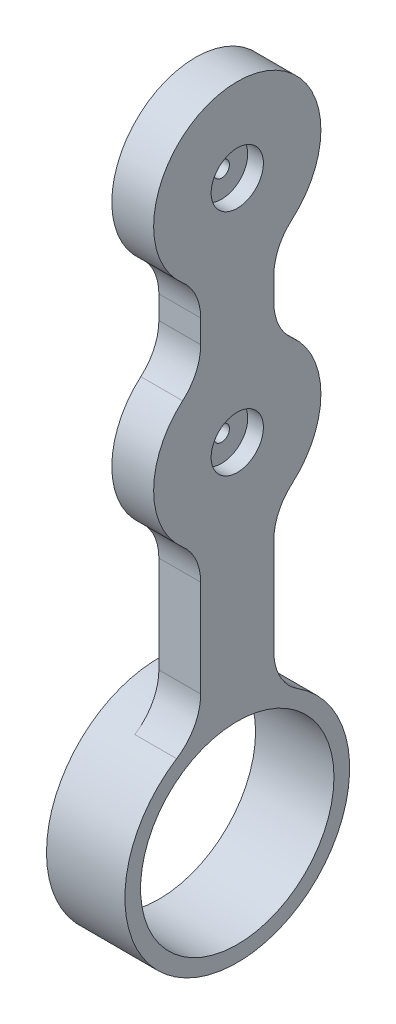
ISO-10303-21;
HEADER;
FILE_DESCRIPTION(('STEP AP214'),'2;1');
FILE_NAME('part.step','',(''),(''),'','','');
FILE_SCHEMA(('AUTOMOTIVE_DESIGN { 1 0 10303 214 1 1 1 1 }'));
ENDSEC;
DATA;
#1=APPLICATION_CONTEXT('core data for automotive mechanical design processes');
#2=APPLICATION_PROTOCOL_DEFINITION('international standard','automotive_design',2000,#1);
#3=PRODUCT_CONTEXT('',#1,'mechanical');
#4=PRODUCT('Part','Part','',(#3));
#5=PRODUCT_RELATED_PRODUCT_CATEGORY('part','',(#4));
#6=PRODUCT_DEFINITION_FORMATION('','',#4);
#7=PRODUCT_DEFINITION_CONTEXT('part definition',#1,'design');
#8=PRODUCT_DEFINITION('design','',#6,#7);
#9=PRODUCT_DEFINITION_SHAPE('','',#8);
#10=(LENGTH_UNIT() NAMED_UNIT(*) SI_UNIT(.MILLI.,.METRE.));
#11=(NAMED_UNIT(*) PLANE_ANGLE_UNIT() SI_UNIT($,.RADIAN.));
#12=(NAMED_UNIT(*) SI_UNIT($,.STERADIAN.) SOLID_ANGLE_UNIT());
#13=UNCERTAINTY_MEASURE_WITH_UNIT(LENGTH_MEASURE(1.E-05),#10,'distance_accuracy_value','');
#14=(GEOMETRIC_REPRESENTATION_CONTEXT(3) GLOBAL_UNCERTAINTY_ASSIGNED_CONTEXT((#13)) GLOBAL_UNIT_ASSIGNED_CONTEXT((#10,
#11,#12)) REPRESENTATION_CONTEXT('',''));
#15=CARTESIAN_POINT('',(0.,0.,0.));
#16=DIRECTION('',(0.,0.,1.));
#17=DIRECTION('',(1.,0.,0.));
#18=AXIS2_PLACEMENT_3D('',#15,#16,#17);
#19=CARTESIAN_POINT('',(-4.,-43.7749891398763,0.));
#20=DIRECTION('',(1.,0.,0.));
#21=DIRECTION('',(0.,0.,-1.));
#22=AXIS2_PLACEMENT_3D('',#19,#20,#21);
#23=PLANE('',#22);
#24=CARTESIAN_POINT('',(-4.,-43.7749891398763,0.));
#25=DIRECTION('',(1.,0.,0.));
#26=DIRECTION('',(0.,0.,-1.));
#27=AXIS2_PLACEMENT_3D('',#24,#25,#26);
#28=CIRCLE('',#27,1.5);
#29=CARTESIAN_POINT('',(-4.,-43.7749891398763,-1.5));
#30=VERTEX_POINT('',#29);
#31=EDGE_CURVE('E347',#30,#30,#28,.F.);
#32=ORIENTED_EDGE('',*,*,#31,.F.);
#33=EDGE_LOOP('',(#32));
#34=FACE_BOUND('',#33,.T.);
#35=CARTESIAN_POINT('',(-4.,0.,0.));
#36=DIRECTION('',(1.,0.,0.));
#37=DIRECTION('',(0.,0.,-1.));
#38=AXIS2_PLACEMENT_3D('',#35,#36,#37);
#39=CIRCLE('',#38,1.5);
#40=CARTESIAN_POINT('',(-4.,0.,-1.5));
#41=VERTEX_POINT('',#40);
#42=EDGE_CURVE('E339',#41,#41,#39,.F.);
#43=ORIENTED_EDGE('',*,*,#42,.F.);
#44=EDGE_LOOP('',(#43));
#45=FACE_BOUND('',#44,.T.);
#46=CARTESIAN_POINT('',(-4.,-108.491035060071,0.));
#47=DIRECTION('',(-1.,0.,0.));
#48=DIRECTION('',(0.,0.,1.));
#49=AXIS2_PLACEMENT_3D('',#46,#47,#48);
#50=CIRCLE('',#49,21.5);
#51=CARTESIAN_POINT('',(-4.,-90.3908599468778,11.6031746031746));
#52=VERTEX_POINT('',#51);
#53=CARTESIAN_POINT('',(-4.,-90.3908599468778,-11.6031746031746));
#54=VERTEX_POINT('',#53);
#55=EDGE_CURVE('E156',#52,#54,#50,.T.);
#56=ORIENTED_EDGE('',*,*,#55,.F.);
#57=CARTESIAN_POINT('',(-4.,-81.9721738477184,17.));
#58=DIRECTION('',(1.,0.,0.));
#59=DIRECTION('',(0.,0.,-1.));
#60=AXIS2_PLACEMENT_3D('',#57,#58,#59);
#61=CIRCLE('',#60,10.);
#62=CARTESIAN_POINT('',(-4.,-81.9721738477184,6.99999999999999));
#63=VERTEX_POINT('',#62);
#64=EDGE_CURVE('E160',#52,#63,#61,.T.);
#65=ORIENTED_EDGE('',*,*,#64,.T.);
#66=DIRECTION('',(0.,-1.,0.));
#67=VECTOR('',#66,1.);
#68=CARTESIAN_POINT('',(-4.,-58.1624837098145,7.));
#69=LINE('',#68,#67);
#70=CARTESIAN_POINT('',(-4.,-63.4473047127823,6.99999999999999));
#71=VERTEX_POINT('',#70);
#72=EDGE_CURVE('E241',#71,#63,#69,.T.);
#73=ORIENTED_EDGE('',*,*,#72,.F.);
#74=CARTESIAN_POINT('',(-4.,-63.4473047127823,17.));
#75=DIRECTION('',(1.,0.,0.));
#76=DIRECTION('',(0.,0.,-1.));
#77=AXIS2_PLACEMENT_3D('',#74,#75,#76);
#78=CIRCLE('',#77,10.);
#79=CARTESIAN_POINT('',(-4.,-55.8810294924339,10.4615384615385));
#80=VERTEX_POINT('',#79);
#81=EDGE_CURVE('E190',#71,#80,#78,.T.);
#82=ORIENTED_EDGE('',*,*,#81,.T.);
#83=CARTESIAN_POINT('',(-4.,-43.7749891398763,0.));
#84=DIRECTION('',(1.,0.,0.));
#85=DIRECTION('',(0.,0.,-1.));
#86=AXIS2_PLACEMENT_3D('',#83,#84,#85);
#87=CIRCLE('',#86,16.);
#88=CARTESIAN_POINT('',(-4.,-31.6689487873188,10.4615384615385));
#89=VERTEX_POINT('',#88);
#90=EDGE_CURVE('E239',#89,#80,#87,.T.);
#91=ORIENTED_EDGE('',*,*,#90,.F.);
#92=CARTESIAN_POINT('',(-4.,-24.1026735669703,17.));
#93=DIRECTION('',(1.,0.,0.));
#94=DIRECTION('',(0.,0.,-1.));
#95=AXIS2_PLACEMENT_3D('',#92,#93,#94);
#96=CIRCLE('',#95,10.);
#97=CARTESIAN_POINT('',(-4.,-24.1026735669703,7.));
#98=VERTEX_POINT('',#97);
#99=EDGE_CURVE('E205',#89,#98,#96,.T.);
#100=ORIENTED_EDGE('',*,*,#99,.T.);
#101=DIRECTION('',(0.,-1.,0.));
#102=VECTOR('',#101,1.);
#103=CARTESIAN_POINT('',(-4.,-14.3874945699382,7.));
#104=LINE('',#103,#102);
#105=CARTESIAN_POINT('',(-4.,-19.672315572906,7.));
#106=VERTEX_POINT('',#105);
#107=EDGE_CURVE('E258',#106,#98,#104,.T.);
#108=ORIENTED_EDGE('',*,*,#107,.F.);
#109=CARTESIAN_POINT('',(-4.,-19.672315572906,17.));
#110=DIRECTION('',(1.,0.,0.));
#111=DIRECTION('',(0.,0.,-1.));
#112=AXIS2_PLACEMENT_3D('',#109,#110,#111);
#113=CIRCLE('',#112,10.);
#114=CARTESIAN_POINT('',(-4.,-12.1060403525575,10.4615384615385));
#115=VERTEX_POINT('',#114);
#116=EDGE_CURVE('E59',#106,#115,#113,.T.);
#117=ORIENTED_EDGE('',*,*,#116,.T.);
#118=CARTESIAN_POINT('',(-4.,0.,0.));
#119=DIRECTION('',(1.,0.,0.));
#120=DIRECTION('',(0.,0.,-1.));
#121=AXIS2_PLACEMENT_3D('',#118,#119,#120);
#122=CIRCLE('',#121,16.);
#123=CARTESIAN_POINT('',(-4.,-12.1060403525575,-10.4615384615385));
#124=VERTEX_POINT('',#123);
#125=EDGE_CURVE('E283',#124,#115,#122,.T.);
#126=ORIENTED_EDGE('',*,*,#125,.F.);
#127=CARTESIAN_POINT('',(-4.,-19.672315572906,-17.));
#128=DIRECTION('',(1.,0.,0.));
#129=DIRECTION('',(0.,0.,-1.));
#130=AXIS2_PLACEMENT_3D('',#127,#128,#129);
#131=CIRCLE('',#130,10.);
#132=CARTESIAN_POINT('',(-4.,-19.672315572906,-7.));
#133=VERTEX_POINT('',#132);
#134=EDGE_CURVE('E12',#124,#133,#131,.T.);
#135=ORIENTED_EDGE('',*,*,#134,.T.);
#136=DIRECTION('',(0.,-1.,0.));
#137=VECTOR('',#136,1.);
#138=CARTESIAN_POINT('',(-4.,-14.3874945699382,-7.));
#139=LINE('',#138,#137);
#140=CARTESIAN_POINT('',(-4.,-24.1026735669703,-7.));
#141=VERTEX_POINT('',#140);
#142=EDGE_CURVE('E294',#133,#141,#139,.T.);
#143=ORIENTED_EDGE('',*,*,#142,.T.);
#144=CARTESIAN_POINT('',(-4.,-24.1026735669703,-17.));
#145=DIRECTION('',(1.,0.,0.));
#146=DIRECTION('',(0.,0.,-1.));
#147=AXIS2_PLACEMENT_3D('',#144,#145,#146);
#148=CIRCLE('',#147,10.);
#149=CARTESIAN_POINT('',(-4.,-31.6689487873188,-10.4615384615385));
#150=VERTEX_POINT('',#149);
#151=EDGE_CURVE('E201',#141,#150,#148,.T.);
#152=ORIENTED_EDGE('',*,*,#151,.T.);
#153=CARTESIAN_POINT('',(-4.,-43.7749891398763,0.));
#154=DIRECTION('',(1.,0.,0.));
#155=DIRECTION('',(0.,0.,-1.));
#156=AXIS2_PLACEMENT_3D('',#153,#154,#155);
#157=CIRCLE('',#156,16.);
#158=CARTESIAN_POINT('',(-4.,-55.8810294924339,-10.4615384615385));
#159=VERTEX_POINT('',#158);
#160=EDGE_CURVE('E291',#159,#150,#157,.T.);
#161=ORIENTED_EDGE('',*,*,#160,.F.);
#162=CARTESIAN_POINT('',(-4.,-63.4473047127823,-17.));
#163=DIRECTION('',(1.,0.,0.));
#164=DIRECTION('',(0.,0.,-1.));
#165=AXIS2_PLACEMENT_3D('',#162,#163,#164);
#166=CIRCLE('',#165,10.);
#167=CARTESIAN_POINT('',(-4.,-63.4473047127823,-6.99999999999999));
#168=VERTEX_POINT('',#167);
#169=EDGE_CURVE('E197',#159,#168,#166,.T.);
#170=ORIENTED_EDGE('',*,*,#169,.T.);
#171=DIRECTION('',(0.,-1.,0.));
#172=VECTOR('',#171,1.);
#173=CARTESIAN_POINT('',(-4.,-58.1624837098145,-7.));
#174=LINE('',#173,#172);
#175=CARTESIAN_POINT('',(-4.,-81.9721738477184,-6.99999999999999));
#176=VERTEX_POINT('',#175);
#177=EDGE_CURVE('E289',#168,#176,#174,.T.);
#178=ORIENTED_EDGE('',*,*,#177,.T.);
#179=CARTESIAN_POINT('',(-4.,-81.9721738477184,-17.));
#180=DIRECTION('',(1.,0.,0.));
#181=DIRECTION('',(0.,0.,-1.));
#182=AXIS2_PLACEMENT_3D('',#179,#180,#181);
#183=CIRCLE('',#182,10.);
#184=EDGE_CURVE('E164',#176,#54,#183,.T.);
#185=ORIENTED_EDGE('',*,*,#184,.T.);
#186=EDGE_LOOP('',(#56,#65,#73,#82,#91,#100,#108,#117,#126,#135,#143,#152,#161,#170,#178,#185));
#187=FACE_BOUND('',#186,.T.);
#188=ADVANCED_FACE('F44',(#34,#45,#187),#23,.F.);
#189=CARTESIAN_POINT('',(-4.,-43.7749891398763,0.));
#190=DIRECTION('',(1.,0.,0.));
#191=DIRECTION('',(0.,0.,-1.));
#192=AXIS2_PLACEMENT_3D('',#189,#190,#191);
#193=CYLINDRICAL_SURFACE('',#192,16.);
#194=ORIENTED_EDGE('',*,*,#90,.T.);
#195=DIRECTION('',(1.,0.,0.));
#196=VECTOR('',#195,1.);
#197=CARTESIAN_POINT('',(-4.,-55.8810294924339,10.4615384615385));
#198=LINE('',#197,#196);
#199=CARTESIAN_POINT('',(4.,-55.8810294924339,10.4615384615385));
#200=VERTEX_POINT('',#199);
#201=EDGE_CURVE('E249',#80,#200,#198,.T.);
#202=ORIENTED_EDGE('',*,*,#201,.T.);
#203=CARTESIAN_POINT('',(4.,-43.7749891398763,0.));
#204=DIRECTION('',(1.,0.,0.));
#205=DIRECTION('',(0.,0.,-1.));
#206=AXIS2_PLACEMENT_3D('',#203,#204,#205);
#207=CIRCLE('',#206,16.);
#208=CARTESIAN_POINT('',(4.,-31.6689487873188,10.4615384615385));
#209=VERTEX_POINT('',#208);
#210=EDGE_CURVE('E329',#209,#200,#207,.T.);
#211=ORIENTED_EDGE('',*,*,#210,.F.);
#212=DIRECTION('',(1.,0.,0.));
#213=VECTOR('',#212,1.);
#214=CARTESIAN_POINT('',(-4.,-31.6689487873188,10.4615384615385));
#215=LINE('',#214,#213);
#216=EDGE_CURVE('E252',#209,#89,#215,.F.);
#217=ORIENTED_EDGE('',*,*,#216,.T.);
#218=EDGE_LOOP('',(#194,#202,#211,#217));
#219=FACE_BOUND('',#218,.T.);
#220=ADVANCED_FACE('F247',(#219),#193,.T.);
#221=CARTESIAN_POINT('',(-4.,-14.3874945699382,7.));
#222=DIRECTION('',(0.,0.,1.));
#223=DIRECTION('',(0.,-1.,0.));
#224=AXIS2_PLACEMENT_3D('',#221,#222,#223);
#225=PLANE('',#224);
#226=ORIENTED_EDGE('',*,*,#107,.T.);
#227=DIRECTION('',(-1.,0.,0.));
#228=VECTOR('',#227,1.);
#229=CARTESIAN_POINT('',(4.,-24.1026735669703,7.));
#230=LINE('',#229,#228);
#231=CARTESIAN_POINT('',(4.,-24.1026735669703,7.));
#232=VERTEX_POINT('',#231);
#233=EDGE_CURVE('E227',#98,#232,#230,.F.);
#234=ORIENTED_EDGE('',*,*,#233,.T.);
#235=DIRECTION('',(0.,-1.,0.));
#236=VECTOR('',#235,1.);
#237=CARTESIAN_POINT('',(4.,-14.3874945699382,7.));
#238=LINE('',#237,#236);
#239=CARTESIAN_POINT('',(4.,-19.672315572906,7.));
#240=VERTEX_POINT('',#239);
#241=EDGE_CURVE('E224',#240,#232,#238,.T.);
#242=ORIENTED_EDGE('',*,*,#241,.F.);
#243=DIRECTION('',(-1.,0.,0.));
#244=VECTOR('',#243,1.);
#245=CARTESIAN_POINT('',(-4.,-19.672315572906,7.));
#246=LINE('',#245,#244);
#247=EDGE_CURVE('E232',#240,#106,#246,.T.);
#248=ORIENTED_EDGE('',*,*,#247,.T.);
#249=EDGE_LOOP('',(#226,#234,#242,#248));
#250=FACE_BOUND('',#249,.T.);
#251=ADVANCED_FACE('F280',(#250),#225,.T.);
#252=CARTESIAN_POINT('',(-4.,0.,0.));
#253=DIRECTION('',(1.,0.,0.));
#254=DIRECTION('',(0.,0.,-1.));
#255=AXIS2_PLACEMENT_3D('',#252,#253,#254);
#256=CYLINDRICAL_SURFACE('',#255,16.);
#257=ORIENTED_EDGE('',*,*,#125,.T.);
#258=DIRECTION('',(1.,0.,0.));
#259=VECTOR('',#258,1.);
#260=CARTESIAN_POINT('',(-4.,-12.1060403525575,10.4615384615385));
#261=LINE('',#260,#259);
#262=CARTESIAN_POINT('',(4.,-12.1060403525575,10.4615384615385));
#263=VERTEX_POINT('',#262);
#264=EDGE_CURVE('E223',#115,#263,#261,.T.);
#265=ORIENTED_EDGE('',*,*,#264,.T.);
#266=CARTESIAN_POINT('',(4.,0.,0.));
#267=DIRECTION('',(1.,0.,0.));
#268=DIRECTION('',(0.,0.,-1.));
#269=AXIS2_PLACEMENT_3D('',#266,#267,#268);
#270=CIRCLE('',#269,16.);
#271=CARTESIAN_POINT('',(4.,-12.1060403525575,-10.4615384615385));
#272=VERTEX_POINT('',#271);
#273=EDGE_CURVE('E214',#272,#263,#270,.T.);
#274=ORIENTED_EDGE('',*,*,#273,.F.);
#275=DIRECTION('',(1.,0.,0.));
#276=VECTOR('',#275,1.);
#277=CARTESIAN_POINT('',(-4.,-12.1060403525575,-10.4615384615385));
#278=LINE('',#277,#276);
#279=EDGE_CURVE('E66',#272,#124,#278,.F.);
#280=ORIENTED_EDGE('',*,*,#279,.T.);
#281=EDGE_LOOP('',(#257,#265,#274,#280));
#282=FACE_BOUND('',#281,.T.);
#283=ADVANCED_FACE('F221',(#282),#256,.T.);
#284=CARTESIAN_POINT('',(-4.,-14.3874945699382,-7.));
#285=DIRECTION('',(0.,0.,1.));
#286=DIRECTION('',(0.,-1.,0.));
#287=AXIS2_PLACEMENT_3D('',#284,#285,#286);
#288=PLANE('',#287);
#289=DIRECTION('',(0.,-1.,0.));
#290=VECTOR('',#289,1.);
#291=CARTESIAN_POINT('',(4.,-14.3874945699382,-7.));
#292=LINE('',#291,#290);
#293=CARTESIAN_POINT('',(4.,-19.672315572906,-7.));
#294=VERTEX_POINT('',#293);
#295=CARTESIAN_POINT('',(4.,-24.1026735669703,-7.));
#296=VERTEX_POINT('',#295);
#297=EDGE_CURVE('E216',#294,#296,#292,.T.);
#298=ORIENTED_EDGE('',*,*,#297,.T.);
#299=DIRECTION('',(1.,0.,0.));
#300=VECTOR('',#299,1.);
#301=CARTESIAN_POINT('',(-4.,-24.1026735669703,-7.));
#302=LINE('',#301,#300);
#303=EDGE_CURVE('E275',#296,#141,#302,.F.);
#304=ORIENTED_EDGE('',*,*,#303,.T.);
#305=ORIENTED_EDGE('',*,*,#142,.F.);
#306=DIRECTION('',(1.,0.,0.));
#307=VECTOR('',#306,1.);
#308=CARTESIAN_POINT('',(-4.,-19.672315572906,-7.));
#309=LINE('',#308,#307);
#310=EDGE_CURVE('E273',#133,#294,#309,.T.);
#311=ORIENTED_EDGE('',*,*,#310,.T.);
#312=EDGE_LOOP('',(#298,#304,#305,#311));
#313=FACE_BOUND('',#312,.T.);
#314=ADVANCED_FACE('F300',(#313),#288,.F.);
#315=CARTESIAN_POINT('',(-4.,-43.7749891398763,0.));
#316=DIRECTION('',(1.,0.,0.));
#317=DIRECTION('',(0.,0.,-1.));
#318=AXIS2_PLACEMENT_3D('',#315,#316,#317);
#319=CYLINDRICAL_SURFACE('',#318,16.);
#320=CARTESIAN_POINT('',(4.,-43.7749891398763,0.));
#321=DIRECTION('',(1.,0.,0.));
#322=DIRECTION('',(0.,0.,-1.));
#323=AXIS2_PLACEMENT_3D('',#320,#321,#322);
#324=CIRCLE('',#323,16.);
#325=CARTESIAN_POINT('',(4.,-55.8810294924339,-10.4615384615385));
#326=VERTEX_POINT('',#325);
#327=CARTESIAN_POINT('',(4.,-31.6689487873188,-10.4615384615385));
#328=VERTEX_POINT('',#327);
#329=EDGE_CURVE('E312',#326,#328,#324,.T.);
#330=ORIENTED_EDGE('',*,*,#329,.F.);
#331=DIRECTION('',(1.,0.,0.));
#332=VECTOR('',#331,1.);
#333=CARTESIAN_POINT('',(-4.,-55.8810294924339,-10.4615384615385));
#334=LINE('',#333,#332);
#335=EDGE_CURVE('E271',#326,#159,#334,.F.);
#336=ORIENTED_EDGE('',*,*,#335,.T.);
#337=ORIENTED_EDGE('',*,*,#160,.T.);
#338=DIRECTION('',(1.,0.,0.));
#339=VECTOR('',#338,1.);
#340=CARTESIAN_POINT('',(-4.,-31.6689487873188,-10.4615384615385));
#341=LINE('',#340,#339);
#342=EDGE_CURVE('E268',#150,#328,#341,.T.);
#343=ORIENTED_EDGE('',*,*,#342,.T.);
#344=EDGE_LOOP('',(#330,#336,#337,#343));
#345=FACE_BOUND('',#344,.T.);
#346=ADVANCED_FACE('F309',(#345),#319,.T.);
#347=CARTESIAN_POINT('',(-4.,-58.1624837098145,-7.));
#348=DIRECTION('',(0.,0.,1.));
#349=DIRECTION('',(0.,-1.,0.));
#350=AXIS2_PLACEMENT_3D('',#347,#348,#349);
#351=PLANE('',#350);
#352=DIRECTION('',(0.,-1.,0.));
#353=VECTOR('',#352,1.);
#354=CARTESIAN_POINT('',(4.,-58.1624837098145,-7.));
#355=LINE('',#354,#353);
#356=CARTESIAN_POINT('',(4.,-63.4473047127823,-6.99999999999999));
#357=VERTEX_POINT('',#356);
#358=CARTESIAN_POINT('',(4.,-81.9721738477184,-6.99999999999999));
#359=VERTEX_POINT('',#358);
#360=EDGE_CURVE('E322',#357,#359,#355,.T.);
#361=ORIENTED_EDGE('',*,*,#360,.T.);
#362=DIRECTION('',(1.,0.,0.));
#363=VECTOR('',#362,1.);
#364=CARTESIAN_POINT('',(-4.,-81.9721738477184,-6.99999999999999));
#365=LINE('',#364,#363);
#366=EDGE_CURVE('E266',#359,#176,#365,.F.);
#367=ORIENTED_EDGE('',*,*,#366,.T.);
#368=ORIENTED_EDGE('',*,*,#177,.F.);
#369=DIRECTION('',(1.,0.,0.));
#370=VECTOR('',#369,1.);
#371=CARTESIAN_POINT('',(-4.,-63.4473047127823,-6.99999999999999));
#372=LINE('',#371,#370);
#373=EDGE_CURVE('E179',#168,#357,#372,.T.);
#374=ORIENTED_EDGE('',*,*,#373,.T.);
#375=EDGE_LOOP('',(#361,#367,#368,#374));
#376=FACE_BOUND('',#375,.T.);
#377=ADVANCED_FACE('F319',(#376),#351,.F.);
#378=CARTESIAN_POINT('',(-4.,-108.491035060071,0.));
#379=DIRECTION('',(1.,0.,0.));
#380=DIRECTION('',(0.,0.,-1.));
#381=AXIS2_PLACEMENT_3D('',#378,#379,#380);
#382=CYLINDRICAL_SURFACE('',#381,21.5);
#383=CARTESIAN_POINT('',(4.,-108.491035060071,0.));
#384=DIRECTION('',(1.,0.,0.));
#385=DIRECTION('',(0.,0.,-1.));
#386=AXIS2_PLACEMENT_3D('',#383,#384,#385);
#387=CIRCLE('',#386,21.5);
#388=CARTESIAN_POINT('',(4.,-90.3908599468778,11.6031746031746));
#389=VERTEX_POINT('',#388);
#390=CARTESIAN_POINT('',(4.,-90.3908599468778,-11.6031746031746));
#391=VERTEX_POINT('',#390);
#392=EDGE_CURVE('E177',#389,#391,#387,.T.);
#393=ORIENTED_EDGE('',*,*,#392,.F.);
#394=DIRECTION('',(1.,0.,0.));
#395=VECTOR('',#394,1.);
#396=CARTESIAN_POINT('',(-4.,-90.3908599468778,11.6031746031746));
#397=LINE('',#396,#395);
#398=EDGE_CURVE('E173',#389,#52,#397,.F.);
#399=ORIENTED_EDGE('',*,*,#398,.T.);
#400=ORIENTED_EDGE('',*,*,#55,.T.);
#401=DIRECTION('',(1.,0.,0.));
#402=VECTOR('',#401,1.);
#403=CARTESIAN_POINT('',(-4.,-90.3908599468778,-11.6031746031746));
#404=LINE('',#403,#402);
#405=EDGE_CURVE('E180',#54,#391,#404,.T.);
#406=ORIENTED_EDGE('',*,*,#405,.T.);
#407=EDGE_LOOP('',(#393,#399,#400,#406));
#408=FACE_BOUND('',#407,.T.);
#409=CARTESIAN_POINT('',(-11.,-108.491035060071,0.));
#410=DIRECTION('',(-1.,0.,0.));
#411=DIRECTION('',(0.,0.,1.));
#412=AXIS2_PLACEMENT_3D('',#409,#410,#411);
#413=CIRCLE('',#412,21.5);
#414=CARTESIAN_POINT('',(-11.,-108.491035060071,21.5));
#415=VERTEX_POINT('',#414);
#416=EDGE_CURVE('E168',#415,#415,#413,.T.);
#417=ORIENTED_EDGE('',*,*,#416,.F.);
#418=EDGE_LOOP('',(#417));
#419=FACE_BOUND('',#418,.T.);
#420=ADVANCED_FACE('F174',(#408,#419),#382,.T.);
#421=CARTESIAN_POINT('',(-4.,-58.1624837098145,7.));
#422=DIRECTION('',(0.,0.,1.));
#423=DIRECTION('',(0.,-1.,0.));
#424=AXIS2_PLACEMENT_3D('',#421,#422,#423);
#425=PLANE('',#424);
#426=DIRECTION('',(0.,-1.,0.));
#427=VECTOR('',#426,1.);
#428=CARTESIAN_POINT('',(4.,-58.1624837098145,7.));
#429=LINE('',#428,#427);
#430=CARTESIAN_POINT('',(4.,-63.4473047127823,6.99999999999999));
#431=VERTEX_POINT('',#430);
#432=CARTESIAN_POINT('',(4.,-81.9721738477184,6.99999999999999));
#433=VERTEX_POINT('',#432);
#434=EDGE_CURVE('E326',#431,#433,#429,.T.);
#435=ORIENTED_EDGE('',*,*,#434,.F.);
#436=DIRECTION('',(-1.,0.,0.));
#437=VECTOR('',#436,1.);
#438=CARTESIAN_POINT('',(-4.,-63.4473047127823,7.));
#439=LINE('',#438,#437);
#440=EDGE_CURVE('E256',#431,#71,#439,.T.);
#441=ORIENTED_EDGE('',*,*,#440,.T.);
#442=ORIENTED_EDGE('',*,*,#72,.T.);
#443=DIRECTION('',(-1.,0.,0.));
#444=VECTOR('',#443,1.);
#445=CARTESIAN_POINT('',(4.,-81.9721738477184,6.99999999999999));
#446=LINE('',#445,#444);
#447=EDGE_CURVE('E185',#63,#433,#446,.F.);
#448=ORIENTED_EDGE('',*,*,#447,.T.);
#449=EDGE_LOOP('',(#435,#441,#442,#448));
#450=FACE_BOUND('',#449,.T.);
#451=ADVANCED_FACE('F406',(#450),#425,.T.);
#452=CARTESIAN_POINT('',(4.,-43.7749891398763,0.));
#453=DIRECTION('',(1.,0.,0.));
#454=DIRECTION('',(0.,0.,-1.));
#455=AXIS2_PLACEMENT_3D('',#452,#453,#454);
#456=PLANE('',#455);
#457=CARTESIAN_POINT('',(4.,-108.491035060071,0.));
#458=DIRECTION('',(1.,0.,0.));
#459=DIRECTION('',(0.,0.,-1.));
#460=AXIS2_PLACEMENT_3D('',#457,#458,#459);
#461=CIRCLE('',#460,18.5);
#462=CARTESIAN_POINT('',(4.,-108.491035060071,-18.5));
#463=VERTEX_POINT('',#462);
#464=EDGE_CURVE('E354',#463,#463,#461,.T.);
#465=ORIENTED_EDGE('',*,*,#464,.F.);
#466=EDGE_LOOP('',(#465));
#467=FACE_BOUND('',#466,.T.);
#468=CARTESIAN_POINT('',(4.,0.,0.));
#469=DIRECTION('',(1.,0.,0.));
#470=DIRECTION('',(0.,0.,-1.));
#471=AXIS2_PLACEMENT_3D('',#468,#469,#470);
#472=CIRCLE('',#471,5.);
#473=CARTESIAN_POINT('',(4.,0.,-5.));
#474=VERTEX_POINT('',#473);
#475=EDGE_CURVE('E342',#474,#474,#472,.T.);
#476=ORIENTED_EDGE('',*,*,#475,.F.);
#477=EDGE_LOOP('',(#476));
#478=FACE_BOUND('',#477,.T.);
#479=CARTESIAN_POINT('',(4.,-43.7749891398763,0.));
#480=DIRECTION('',(1.,0.,0.));
#481=DIRECTION('',(0.,0.,-1.));
#482=AXIS2_PLACEMENT_3D('',#479,#480,#481);
#483=CIRCLE('',#482,5.);
#484=CARTESIAN_POINT('',(4.,-43.7749891398763,-5.));
#485=VERTEX_POINT('',#484);
#486=EDGE_CURVE('E335',#485,#485,#483,.T.);
#487=ORIENTED_EDGE('',*,*,#486,.F.);
#488=EDGE_LOOP('',(#487));
#489=FACE_BOUND('',#488,.T.);
#490=ORIENTED_EDGE('',*,*,#241,.T.);
#491=CARTESIAN_POINT('',(4.,-24.1026735669703,17.));
#492=DIRECTION('',(1.,0.,0.));
#493=DIRECTION('',(0.,0.,-1.));
#494=AXIS2_PLACEMENT_3D('',#491,#492,#493);
#495=CIRCLE('',#494,10.);
#496=EDGE_CURVE('E203',#232,#209,#495,.F.);
#497=ORIENTED_EDGE('',*,*,#496,.T.);
#498=ORIENTED_EDGE('',*,*,#210,.T.);
#499=CARTESIAN_POINT('',(4.,-63.4473047127823,17.));
#500=DIRECTION('',(1.,0.,0.));
#501=DIRECTION('',(0.,0.,-1.));
#502=AXIS2_PLACEMENT_3D('',#499,#500,#501);
#503=CIRCLE('',#502,10.);
#504=EDGE_CURVE('E229',#200,#431,#503,.F.);
#505=ORIENTED_EDGE('',*,*,#504,.T.);
#506=ORIENTED_EDGE('',*,*,#434,.T.);
#507=CARTESIAN_POINT('',(4.,-81.9721738477184,17.));
#508=DIRECTION('',(1.,0.,0.));
#509=DIRECTION('',(0.,0.,-1.));
#510=AXIS2_PLACEMENT_3D('',#507,#508,#509);
#511=CIRCLE('',#510,10.);
#512=EDGE_CURVE('E187',#433,#389,#511,.F.);
#513=ORIENTED_EDGE('',*,*,#512,.T.);
#514=ORIENTED_EDGE('',*,*,#392,.T.);
#515=CARTESIAN_POINT('',(4.,-81.9721738477184,-17.));
#516=DIRECTION('',(1.,0.,0.));
#517=DIRECTION('',(0.,0.,-1.));
#518=AXIS2_PLACEMENT_3D('',#515,#516,#517);
#519=CIRCLE('',#518,10.);
#520=EDGE_CURVE('E186',#391,#359,#519,.F.);
#521=ORIENTED_EDGE('',*,*,#520,.T.);
#522=ORIENTED_EDGE('',*,*,#360,.F.);
#523=CARTESIAN_POINT('',(4.,-63.4473047127823,-17.));
#524=DIRECTION('',(1.,0.,0.));
#525=DIRECTION('',(0.,0.,-1.));
#526=AXIS2_PLACEMENT_3D('',#523,#524,#525);
#527=CIRCLE('',#526,10.);
#528=EDGE_CURVE('E195',#357,#326,#527,.F.);
#529=ORIENTED_EDGE('',*,*,#528,.T.);
#530=ORIENTED_EDGE('',*,*,#329,.T.);
#531=CARTESIAN_POINT('',(4.,-24.1026735669703,-17.));
#532=DIRECTION('',(1.,0.,0.));
#533=DIRECTION('',(0.,0.,-1.));
#534=AXIS2_PLACEMENT_3D('',#531,#532,#533);
#535=CIRCLE('',#534,10.);
#536=EDGE_CURVE('E199',#328,#296,#535,.F.);
#537=ORIENTED_EDGE('',*,*,#536,.T.);
#538=ORIENTED_EDGE('',*,*,#297,.F.);
#539=CARTESIAN_POINT('',(4.,-19.672315572906,-17.));
#540=DIRECTION('',(1.,0.,0.));
#541=DIRECTION('',(0.,0.,-1.));
#542=AXIS2_PLACEMENT_3D('',#539,#540,#541);
#543=CIRCLE('',#542,10.);
#544=EDGE_CURVE('E52',#294,#272,#543,.F.);
#545=ORIENTED_EDGE('',*,*,#544,.T.);
#546=ORIENTED_EDGE('',*,*,#273,.T.);
#547=CARTESIAN_POINT('',(4.,-19.672315572906,17.));
#548=DIRECTION('',(1.,0.,0.));
#549=DIRECTION('',(0.,0.,-1.));
#550=AXIS2_PLACEMENT_3D('',#547,#548,#549);
#551=CIRCLE('',#550,10.);
#552=EDGE_CURVE('E207',#263,#240,#551,.F.);
#553=ORIENTED_EDGE('',*,*,#552,.T.);
#554=EDGE_LOOP('',(#490,#497,#498,#505,#506,#513,#514,#521,#522,#529,#530,#537,#538,#545,#546,#553));
#555=FACE_BOUND('',#554,.T.);
#556=ADVANCED_FACE('F213',(#467,#478,#489,#555),#456,.T.);
#557=CARTESIAN_POINT('',(-4.,-63.4473047127823,17.));
#558=DIRECTION('',(1.,0.,0.));
#559=DIRECTION('',(0.,0.,-1.));
#560=AXIS2_PLACEMENT_3D('',#557,#558,#559);
#561=CYLINDRICAL_SURFACE('',#560,10.);
#562=ORIENTED_EDGE('',*,*,#81,.F.);
#563=ORIENTED_EDGE('',*,*,#440,.F.);
#564=ORIENTED_EDGE('',*,*,#504,.F.);
#565=ORIENTED_EDGE('',*,*,#201,.F.);
#566=EDGE_LOOP('',(#562,#563,#564,#565));
#567=FACE_BOUND('',#566,.T.);
#568=ADVANCED_FACE('F254',(#567),#561,.F.);
#569=CARTESIAN_POINT('',(-4.,-81.9721738477184,17.));
#570=DIRECTION('',(1.,0.,0.));
#571=DIRECTION('',(0.,0.,-1.));
#572=AXIS2_PLACEMENT_3D('',#569,#570,#571);
#573=CYLINDRICAL_SURFACE('',#572,10.);
#574=ORIENTED_EDGE('',*,*,#64,.F.);
#575=ORIENTED_EDGE('',*,*,#398,.F.);
#576=ORIENTED_EDGE('',*,*,#512,.F.);
#577=ORIENTED_EDGE('',*,*,#447,.F.);
#578=EDGE_LOOP('',(#574,#575,#576,#577));
#579=FACE_BOUND('',#578,.T.);
#580=ADVANCED_FACE('F183',(#579),#573,.F.);
#581=CARTESIAN_POINT('',(-4.,-81.9721738477184,-17.));
#582=DIRECTION('',(1.,0.,0.));
#583=DIRECTION('',(0.,0.,-1.));
#584=AXIS2_PLACEMENT_3D('',#581,#582,#583);
#585=CYLINDRICAL_SURFACE('',#584,10.);
#586=ORIENTED_EDGE('',*,*,#184,.F.);
#587=ORIENTED_EDGE('',*,*,#366,.F.);
#588=ORIENTED_EDGE('',*,*,#520,.F.);
#589=ORIENTED_EDGE('',*,*,#405,.F.);
#590=EDGE_LOOP('',(#586,#587,#588,#589));
#591=FACE_BOUND('',#590,.T.);
#592=ADVANCED_FACE('F324',(#591),#585,.F.);
#593=CARTESIAN_POINT('',(-4.,-63.4473047127823,-17.));
#594=DIRECTION('',(1.,0.,0.));
#595=DIRECTION('',(0.,0.,-1.));
#596=AXIS2_PLACEMENT_3D('',#593,#594,#595);
#597=CYLINDRICAL_SURFACE('',#596,10.);
#598=ORIENTED_EDGE('',*,*,#169,.F.);
#599=ORIENTED_EDGE('',*,*,#335,.F.);
#600=ORIENTED_EDGE('',*,*,#528,.F.);
#601=ORIENTED_EDGE('',*,*,#373,.F.);
#602=EDGE_LOOP('',(#598,#599,#600,#601));
#603=FACE_BOUND('',#602,.T.);
#604=ADVANCED_FACE('F314',(#603),#597,.F.);
#605=CARTESIAN_POINT('',(-4.,-24.1026735669703,-17.));
#606=DIRECTION('',(1.,0.,0.));
#607=DIRECTION('',(0.,0.,-1.));
#608=AXIS2_PLACEMENT_3D('',#605,#606,#607);
#609=CYLINDRICAL_SURFACE('',#608,10.);
#610=ORIENTED_EDGE('',*,*,#151,.F.);
#611=ORIENTED_EDGE('',*,*,#303,.F.);
#612=ORIENTED_EDGE('',*,*,#536,.F.);
#613=ORIENTED_EDGE('',*,*,#342,.F.);
#614=EDGE_LOOP('',(#610,#611,#612,#613));
#615=FACE_BOUND('',#614,.T.);
#616=ADVANCED_FACE('F303',(#615),#609,.F.);
#617=CARTESIAN_POINT('',(-4.,-24.1026735669703,17.));
#618=DIRECTION('',(1.,0.,0.));
#619=DIRECTION('',(0.,0.,-1.));
#620=AXIS2_PLACEMENT_3D('',#617,#618,#619);
#621=CYLINDRICAL_SURFACE('',#620,10.);
#622=ORIENTED_EDGE('',*,*,#99,.F.);
#623=ORIENTED_EDGE('',*,*,#216,.F.);
#624=ORIENTED_EDGE('',*,*,#496,.F.);
#625=ORIENTED_EDGE('',*,*,#233,.F.);
#626=EDGE_LOOP('',(#622,#623,#624,#625));
#627=FACE_BOUND('',#626,.T.);
#628=ADVANCED_FACE('F420',(#627),#621,.F.);
#629=CARTESIAN_POINT('',(-4.,-19.672315572906,17.));
#630=DIRECTION('',(1.,0.,0.));
#631=DIRECTION('',(0.,0.,-1.));
#632=AXIS2_PLACEMENT_3D('',#629,#630,#631);
#633=CYLINDRICAL_SURFACE('',#632,10.);
#634=ORIENTED_EDGE('',*,*,#116,.F.);
#635=ORIENTED_EDGE('',*,*,#247,.F.);
#636=ORIENTED_EDGE('',*,*,#552,.F.);
#637=ORIENTED_EDGE('',*,*,#264,.F.);
#638=EDGE_LOOP('',(#634,#635,#636,#637));
#639=FACE_BOUND('',#638,.T.);
#640=ADVANCED_FACE('F284',(#639),#633,.F.);
#641=CARTESIAN_POINT('',(-4.,-19.672315572906,-17.));
#642=DIRECTION('',(1.,0.,0.));
#643=DIRECTION('',(0.,0.,-1.));
#644=AXIS2_PLACEMENT_3D('',#641,#642,#643);
#645=CYLINDRICAL_SURFACE('',#644,10.);
#646=ORIENTED_EDGE('',*,*,#134,.F.);
#647=ORIENTED_EDGE('',*,*,#279,.F.);
#648=ORIENTED_EDGE('',*,*,#544,.F.);
#649=ORIENTED_EDGE('',*,*,#310,.F.);
#650=EDGE_LOOP('',(#646,#647,#648,#649));
#651=FACE_BOUND('',#650,.T.);
#652=ADVANCED_FACE('F46',(#651),#645,.F.);
#653=CARTESIAN_POINT('',(1.,-43.7749891398763,0.));
#654=DIRECTION('',(1.,0.,0.));
#655=DIRECTION('',(0.,0.,-1.));
#656=AXIS2_PLACEMENT_3D('',#653,#654,#655);
#657=CYLINDRICAL_SURFACE('',#656,5.);
#658=CARTESIAN_POINT('',(1.,-43.7749891398763,0.));
#659=DIRECTION('',(1.,0.,0.));
#660=DIRECTION('',(0.,0.,-1.));
#661=AXIS2_PLACEMENT_3D('',#658,#659,#660);
#662=CIRCLE('',#661,5.);
#663=CARTESIAN_POINT('',(1.,-43.7749891398763,-5.));
#664=VERTEX_POINT('',#663);
#665=EDGE_CURVE('E338',#664,#664,#662,.T.);
#666=ORIENTED_EDGE('',*,*,#665,.F.);
#667=EDGE_LOOP('',(#666));
#668=FACE_BOUND('',#667,.T.);
#669=ORIENTED_EDGE('',*,*,#486,.T.);
#670=EDGE_LOOP('',(#669));
#671=FACE_BOUND('',#670,.T.);
#672=ADVANCED_FACE('F427',(#668,#671),#657,.F.);
#673=CARTESIAN_POINT('',(1.,-43.7749891398763,0.));
#674=DIRECTION('',(1.,0.,0.));
#675=DIRECTION('',(0.,0.,-1.));
#676=AXIS2_PLACEMENT_3D('',#673,#674,#675);
#677=PLANE('',#676);
#678=CARTESIAN_POINT('',(1.,-43.7749891398763,0.));
#679=DIRECTION('',(1.,0.,0.));
#680=DIRECTION('',(0.,0.,-1.));
#681=AXIS2_PLACEMENT_3D('',#678,#679,#680);
#682=CIRCLE('',#681,1.5);
#683=CARTESIAN_POINT('',(1.,-43.7749891398763,-1.5));
#684=VERTEX_POINT('',#683);
#685=EDGE_CURVE('E351',#684,#684,#682,.T.);
#686=ORIENTED_EDGE('',*,*,#685,.F.);
#687=EDGE_LOOP('',(#686));
#688=FACE_BOUND('',#687,.T.);
#689=ORIENTED_EDGE('',*,*,#665,.T.);
#690=EDGE_LOOP('',(#689));
#691=FACE_BOUND('',#690,.T.);
#692=ADVANCED_FACE('F431',(#688,#691),#677,.T.);
#693=CARTESIAN_POINT('',(1.,0.,0.));
#694=DIRECTION('',(1.,0.,0.));
#695=DIRECTION('',(0.,0.,-1.));
#696=AXIS2_PLACEMENT_3D('',#693,#694,#695);
#697=CYLINDRICAL_SURFACE('',#696,5.);
#698=CARTESIAN_POINT('',(1.,0.,0.));
#699=DIRECTION('',(1.,0.,0.));
#700=DIRECTION('',(0.,0.,-1.));
#701=AXIS2_PLACEMENT_3D('',#698,#699,#700);
#702=CIRCLE('',#701,5.);
#703=CARTESIAN_POINT('',(1.,0.,-5.));
#704=VERTEX_POINT('',#703);
#705=EDGE_CURVE('E334',#704,#704,#702,.T.);
#706=ORIENTED_EDGE('',*,*,#705,.F.);
#707=EDGE_LOOP('',(#706));
#708=FACE_BOUND('',#707,.T.);
#709=ORIENTED_EDGE('',*,*,#475,.T.);
#710=EDGE_LOOP('',(#709));
#711=FACE_BOUND('',#710,.T.);
#712=ADVANCED_FACE('F436',(#708,#711),#697,.F.);
#713=CARTESIAN_POINT('',(1.,0.,0.));
#714=DIRECTION('',(1.,0.,0.));
#715=DIRECTION('',(0.,0.,-1.));
#716=AXIS2_PLACEMENT_3D('',#713,#714,#715);
#717=PLANE('',#716);
#718=CARTESIAN_POINT('',(1.,0.,0.));
#719=DIRECTION('',(1.,0.,0.));
#720=DIRECTION('',(0.,0.,-1.));
#721=AXIS2_PLACEMENT_3D('',#718,#719,#720);
#722=CIRCLE('',#721,1.5);
#723=CARTESIAN_POINT('',(1.,0.,-1.5));
#724=VERTEX_POINT('',#723);
#725=EDGE_CURVE('E350',#724,#724,#722,.T.);
#726=ORIENTED_EDGE('',*,*,#725,.F.);
#727=EDGE_LOOP('',(#726));
#728=FACE_BOUND('',#727,.T.);
#729=ORIENTED_EDGE('',*,*,#705,.T.);
#730=EDGE_LOOP('',(#729));
#731=FACE_BOUND('',#730,.T.);
#732=ADVANCED_FACE('F444',(#728,#731),#717,.T.);
#733=CARTESIAN_POINT('',(-8.24264068711929,-43.7749891398763,0.));
#734=DIRECTION('',(1.,0.,0.));
#735=DIRECTION('',(0.,0.,-1.));
#736=AXIS2_PLACEMENT_3D('',#733,#734,#735);
#737=CYLINDRICAL_SURFACE('',#736,1.5);
#738=ORIENTED_EDGE('',*,*,#31,.T.);
#739=EDGE_LOOP('',(#738));
#740=FACE_BOUND('',#739,.T.);
#741=ORIENTED_EDGE('',*,*,#685,.T.);
#742=EDGE_LOOP('',(#741));
#743=FACE_BOUND('',#742,.T.);
#744=ADVANCED_FACE('F379',(#740,#743),#737,.F.);
#745=CARTESIAN_POINT('',(-8.24264068711929,0.,0.));
#746=DIRECTION('',(1.,0.,0.));
#747=DIRECTION('',(0.,0.,-1.));
#748=AXIS2_PLACEMENT_3D('',#745,#746,#747);
#749=CYLINDRICAL_SURFACE('',#748,1.5);
#750=ORIENTED_EDGE('',*,*,#42,.T.);
#751=EDGE_LOOP('',(#750));
#752=FACE_BOUND('',#751,.T.);
#753=ORIENTED_EDGE('',*,*,#725,.T.);
#754=EDGE_LOOP('',(#753));
#755=FACE_BOUND('',#754,.T.);
#756=ADVANCED_FACE('F371',(#752,#755),#749,.F.);
#757=CARTESIAN_POINT('',(-56.3259018078045,-108.491035060071,0.));
#758=DIRECTION('',(1.,0.,0.));
#759=DIRECTION('',(0.,0.,-1.));
#760=AXIS2_PLACEMENT_3D('',#757,#758,#759);
#761=CYLINDRICAL_SURFACE('',#760,18.5);
#762=ORIENTED_EDGE('',*,*,#464,.T.);
#763=EDGE_LOOP('',(#762));
#764=FACE_BOUND('',#763,.T.);
#765=CARTESIAN_POINT('',(-11.,-108.491035060071,0.));
#766=DIRECTION('',(-1.,0.,0.));
#767=DIRECTION('',(0.,0.,1.));
#768=AXIS2_PLACEMENT_3D('',#765,#766,#767);
#769=CIRCLE('',#768,18.5);
#770=CARTESIAN_POINT('',(-11.,-108.491035060071,18.5));
#771=VERTEX_POINT('',#770);
#772=EDGE_CURVE('E169',#771,#771,#769,.F.);
#773=ORIENTED_EDGE('',*,*,#772,.F.);
#774=EDGE_LOOP('',(#773));
#775=FACE_BOUND('',#774,.T.);
#776=ADVANCED_FACE('F369',(#764,#775),#761,.F.);
#777=CARTESIAN_POINT('',(-11.,-108.491035060071,0.));
#778=DIRECTION('',(-1.,0.,0.));
#779=DIRECTION('',(0.,0.,1.));
#780=AXIS2_PLACEMENT_3D('',#777,#778,#779);
#781=PLANE('',#780);
#782=ORIENTED_EDGE('',*,*,#772,.T.);
#783=EDGE_LOOP('',(#782));
#784=FACE_BOUND('',#783,.T.);
#785=ORIENTED_EDGE('',*,*,#416,.T.);
#786=EDGE_LOOP('',(#785));
#787=FACE_BOUND('',#786,.T.);
#788=ADVANCED_FACE('F366',(#784,#787),#781,.T.);
#789=CLOSED_SHELL('',(#188,#220,#251,#283,#314,#346,#377,#420,#451,#556,#568,#580,#592,#604,
#616,#628,#640,#652,#672,#692,#712,#732,#744,#756,#776,#788));
#790=MANIFOLD_SOLID_BREP('B2',#789);
#791=ADVANCED_BREP_SHAPE_REPRESENTATION('',(#18,#790),#14);
#792=SHAPE_DEFINITION_REPRESENTATION(#9,#791);
ENDSEC;
END-ISO-10303-21;
